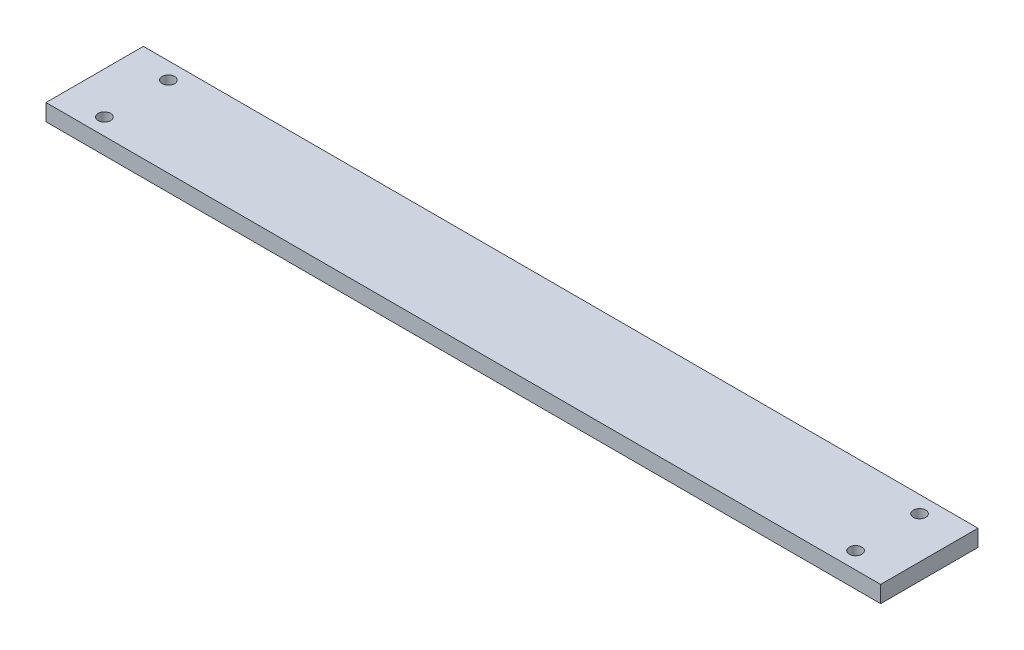
ISO-10303-21;
HEADER;
FILE_DESCRIPTION(('STEP AP214'),'2;1');
FILE_NAME('part.step','',(''),(''),'','','');
FILE_SCHEMA(('AUTOMOTIVE_DESIGN { 1 0 10303 214 1 1 1 1 }'));
ENDSEC;
DATA;
#1=APPLICATION_CONTEXT('core data for automotive mechanical design processes');
#2=APPLICATION_PROTOCOL_DEFINITION('international standard','automotive_design',2000,#1);
#3=PRODUCT_CONTEXT('',#1,'mechanical');
#4=PRODUCT('Part','Part','',(#3));
#5=PRODUCT_RELATED_PRODUCT_CATEGORY('part','',(#4));
#6=PRODUCT_DEFINITION_FORMATION('','',#4);
#7=PRODUCT_DEFINITION_CONTEXT('part definition',#1,'design');
#8=PRODUCT_DEFINITION('design','',#6,#7);
#9=PRODUCT_DEFINITION_SHAPE('','',#8);
#10=(LENGTH_UNIT() NAMED_UNIT(*) SI_UNIT(.MILLI.,.METRE.));
#11=(NAMED_UNIT(*) PLANE_ANGLE_UNIT() SI_UNIT($,.RADIAN.));
#12=(NAMED_UNIT(*) SI_UNIT($,.STERADIAN.) SOLID_ANGLE_UNIT());
#13=UNCERTAINTY_MEASURE_WITH_UNIT(LENGTH_MEASURE(1.E-05),#10,'distance_accuracy_value','');
#14=(GEOMETRIC_REPRESENTATION_CONTEXT(3) GLOBAL_UNCERTAINTY_ASSIGNED_CONTEXT((#13)) GLOBAL_UNIT_ASSIGNED_CONTEXT((#10,
#11,#12)) REPRESENTATION_CONTEXT('',''));
#15=CARTESIAN_POINT('',(0.,0.,0.));
#16=DIRECTION('',(0.,0.,1.));
#17=DIRECTION('',(1.,0.,0.));
#18=AXIS2_PLACEMENT_3D('',#15,#16,#17);
#19=CARTESIAN_POINT('',(0.,12.,0.));
#20=DIRECTION('',(0.,-1.,0.));
#21=DIRECTION('',(0.,0.,-1.));
#22=AXIS2_PLACEMENT_3D('',#19,#20,#21);
#23=PLANE('',#22);
#24=DIRECTION('',(0.,0.,-1.));
#25=VECTOR('',#24,1.);
#26=CARTESIAN_POINT('',(300.,12.,35.));
#27=LINE('',#26,#25);
#28=CARTESIAN_POINT('',(300.,12.,35.));
#29=VERTEX_POINT('',#28);
#30=CARTESIAN_POINT('',(300.,12.,-35.));
#31=VERTEX_POINT('',#30);
#32=EDGE_CURVE('E89',#29,#31,#27,.T.);
#33=ORIENTED_EDGE('',*,*,#32,.T.);
#34=DIRECTION('',(-1.,0.,0.));
#35=VECTOR('',#34,1.);
#36=CARTESIAN_POINT('',(-300.,12.,-35.));
#37=LINE('',#36,#35);
#38=CARTESIAN_POINT('',(-300.,12.,-35.));
#39=VERTEX_POINT('',#38);
#40=EDGE_CURVE('E84',#31,#39,#37,.T.);
#41=ORIENTED_EDGE('',*,*,#40,.T.);
#42=DIRECTION('',(0.,0.,1.));
#43=VECTOR('',#42,1.);
#44=CARTESIAN_POINT('',(-300.,12.,35.));
#45=LINE('',#44,#43);
#46=CARTESIAN_POINT('',(-300.,12.,35.));
#47=VERTEX_POINT('',#46);
#48=EDGE_CURVE('E87',#39,#47,#45,.T.);
#49=ORIENTED_EDGE('',*,*,#48,.T.);
#50=DIRECTION('',(1.,0.,0.));
#51=VECTOR('',#50,1.);
#52=CARTESIAN_POINT('',(-300.,12.,35.));
#53=LINE('',#52,#51);
#54=EDGE_CURVE('E54',#47,#29,#53,.T.);
#55=ORIENTED_EDGE('',*,*,#54,.T.);
#56=EDGE_LOOP('',(#33,#41,#49,#55));
#57=FACE_BOUND('',#56,.T.);
#58=CARTESIAN_POINT('',(-270.,12.,23.));
#59=DIRECTION('',(0.,1.,0.));
#60=DIRECTION('',(0.,0.,1.));
#61=AXIS2_PLACEMENT_3D('',#58,#59,#60);
#62=CIRCLE('',#61,4.50000000000002);
#63=CARTESIAN_POINT('',(-270.,12.,27.5));
#64=VERTEX_POINT('',#63);
#65=EDGE_CURVE('E104',#64,#64,#62,.T.);
#66=ORIENTED_EDGE('',*,*,#65,.F.);
#67=EDGE_LOOP('',(#66));
#68=FACE_BOUND('',#67,.T.);
#69=CARTESIAN_POINT('',(-270.,12.,-23.));
#70=DIRECTION('',(0.,1.,0.));
#71=DIRECTION('',(0.,0.,1.));
#72=AXIS2_PLACEMENT_3D('',#69,#70,#71);
#73=CIRCLE('',#72,4.50000000000002);
#74=CARTESIAN_POINT('',(-270.,12.,-18.5));
#75=VERTEX_POINT('',#74);
#76=EDGE_CURVE('E119',#75,#75,#73,.T.);
#77=ORIENTED_EDGE('',*,*,#76,.F.);
#78=EDGE_LOOP('',(#77));
#79=FACE_BOUND('',#78,.T.);
#80=CARTESIAN_POINT('',(270.,12.,23.));
#81=DIRECTION('',(0.,1.,0.));
#82=DIRECTION('',(0.,0.,1.));
#83=AXIS2_PLACEMENT_3D('',#80,#81,#82);
#84=CIRCLE('',#83,4.50000000000002);
#85=CARTESIAN_POINT('',(270.,12.,27.5));
#86=VERTEX_POINT('',#85);
#87=EDGE_CURVE('E125',#86,#86,#84,.T.);
#88=ORIENTED_EDGE('',*,*,#87,.F.);
#89=EDGE_LOOP('',(#88));
#90=FACE_BOUND('',#89,.T.);
#91=CARTESIAN_POINT('',(270.,12.,-23.));
#92=DIRECTION('',(0.,1.,0.));
#93=DIRECTION('',(0.,0.,1.));
#94=AXIS2_PLACEMENT_3D('',#91,#92,#93);
#95=CIRCLE('',#94,4.50000000000002);
#96=CARTESIAN_POINT('',(270.,12.,-18.5));
#97=VERTEX_POINT('',#96);
#98=EDGE_CURVE('E131',#97,#97,#95,.T.);
#99=ORIENTED_EDGE('',*,*,#98,.F.);
#100=EDGE_LOOP('',(#99));
#101=FACE_BOUND('',#100,.T.);
#102=ADVANCED_FACE('F37',(#57,#68,#79,#90,#101),#23,.F.);
#103=CARTESIAN_POINT('',(0.,0.,0.));
#104=DIRECTION('',(0.,-1.,0.));
#105=DIRECTION('',(0.,0.,-1.));
#106=AXIS2_PLACEMENT_3D('',#103,#104,#105);
#107=PLANE('',#106);
#108=CARTESIAN_POINT('',(270.,0.,23.));
#109=DIRECTION('',(0.,1.,0.));
#110=DIRECTION('',(0.,0.,1.));
#111=AXIS2_PLACEMENT_3D('',#108,#109,#110);
#112=CIRCLE('',#111,4.50000000000002);
#113=CARTESIAN_POINT('',(270.,0.,27.5));
#114=VERTEX_POINT('',#113);
#115=EDGE_CURVE('E128',#114,#114,#112,.T.);
#116=ORIENTED_EDGE('',*,*,#115,.T.);
#117=EDGE_LOOP('',(#116));
#118=FACE_BOUND('',#117,.T.);
#119=CARTESIAN_POINT('',(-270.,0.,23.));
#120=DIRECTION('',(0.,1.,0.));
#121=DIRECTION('',(0.,0.,1.));
#122=AXIS2_PLACEMENT_3D('',#119,#120,#121);
#123=CIRCLE('',#122,4.50000000000002);
#124=CARTESIAN_POINT('',(-270.,0.,27.5));
#125=VERTEX_POINT('',#124);
#126=EDGE_CURVE('E116',#125,#125,#123,.T.);
#127=ORIENTED_EDGE('',*,*,#126,.T.);
#128=EDGE_LOOP('',(#127));
#129=FACE_BOUND('',#128,.T.);
#130=DIRECTION('',(0.,0.,-1.));
#131=VECTOR('',#130,1.);
#132=CARTESIAN_POINT('',(300.,0.,35.));
#133=LINE('',#132,#131);
#134=CARTESIAN_POINT('',(300.,0.,35.));
#135=VERTEX_POINT('',#134);
#136=CARTESIAN_POINT('',(300.,0.,-35.));
#137=VERTEX_POINT('',#136);
#138=EDGE_CURVE('E101',#135,#137,#133,.T.);
#139=ORIENTED_EDGE('',*,*,#138,.F.);
#140=DIRECTION('',(1.,0.,0.));
#141=VECTOR('',#140,1.);
#142=CARTESIAN_POINT('',(-300.,0.,35.));
#143=LINE('',#142,#141);
#144=CARTESIAN_POINT('',(-300.,0.,35.));
#145=VERTEX_POINT('',#144);
#146=EDGE_CURVE('E77',#145,#135,#143,.T.);
#147=ORIENTED_EDGE('',*,*,#146,.F.);
#148=DIRECTION('',(0.,0.,1.));
#149=VECTOR('',#148,1.);
#150=CARTESIAN_POINT('',(-300.,0.,35.));
#151=LINE('',#150,#149);
#152=CARTESIAN_POINT('',(-300.,0.,-35.));
#153=VERTEX_POINT('',#152);
#154=EDGE_CURVE('E71',#153,#145,#151,.T.);
#155=ORIENTED_EDGE('',*,*,#154,.F.);
#156=DIRECTION('',(-1.,0.,0.));
#157=VECTOR('',#156,1.);
#158=CARTESIAN_POINT('',(-300.,0.,-35.));
#159=LINE('',#158,#157);
#160=EDGE_CURVE('E93',#137,#153,#159,.T.);
#161=ORIENTED_EDGE('',*,*,#160,.F.);
#162=EDGE_LOOP('',(#139,#147,#155,#161));
#163=FACE_BOUND('',#162,.T.);
#164=CARTESIAN_POINT('',(-270.,0.,-23.));
#165=DIRECTION('',(0.,1.,0.));
#166=DIRECTION('',(0.,0.,1.));
#167=AXIS2_PLACEMENT_3D('',#164,#165,#166);
#168=CIRCLE('',#167,4.50000000000002);
#169=CARTESIAN_POINT('',(-270.,0.,-18.5));
#170=VERTEX_POINT('',#169);
#171=EDGE_CURVE('E122',#170,#170,#168,.T.);
#172=ORIENTED_EDGE('',*,*,#171,.T.);
#173=EDGE_LOOP('',(#172));
#174=FACE_BOUND('',#173,.T.);
#175=CARTESIAN_POINT('',(270.,0.,-23.));
#176=DIRECTION('',(0.,1.,0.));
#177=DIRECTION('',(0.,0.,1.));
#178=AXIS2_PLACEMENT_3D('',#175,#176,#177);
#179=CIRCLE('',#178,4.50000000000002);
#180=CARTESIAN_POINT('',(270.,0.,-18.5));
#181=VERTEX_POINT('',#180);
#182=EDGE_CURVE('E134',#181,#181,#179,.T.);
#183=ORIENTED_EDGE('',*,*,#182,.T.);
#184=EDGE_LOOP('',(#183));
#185=FACE_BOUND('',#184,.T.);
#186=ADVANCED_FACE('F112',(#118,#129,#163,#174,#185),#107,.T.);
#187=CARTESIAN_POINT('',(300.,12.,35.));
#188=DIRECTION('',(-1.,0.,0.));
#189=DIRECTION('',(0.,0.,1.));
#190=AXIS2_PLACEMENT_3D('',#187,#188,#189);
#191=PLANE('',#190);
#192=ORIENTED_EDGE('',*,*,#138,.T.);
#193=DIRECTION('',(0.,-1.,0.));
#194=VECTOR('',#193,1.);
#195=CARTESIAN_POINT('',(300.,12.,-35.));
#196=LINE('',#195,#194);
#197=EDGE_CURVE('E11',#31,#137,#196,.T.);
#198=ORIENTED_EDGE('',*,*,#197,.F.);
#199=ORIENTED_EDGE('',*,*,#32,.F.);
#200=DIRECTION('',(0.,-1.,0.));
#201=VECTOR('',#200,1.);
#202=CARTESIAN_POINT('',(300.,12.,35.));
#203=LINE('',#202,#201);
#204=EDGE_CURVE('E97',#29,#135,#203,.T.);
#205=ORIENTED_EDGE('',*,*,#204,.T.);
#206=EDGE_LOOP('',(#192,#198,#199,#205));
#207=FACE_BOUND('',#206,.T.);
#208=ADVANCED_FACE('F39',(#207),#191,.F.);
#209=CARTESIAN_POINT('',(-300.,12.,-35.));
#210=DIRECTION('',(0.,0.,1.));
#211=DIRECTION('',(1.,0.,0.));
#212=AXIS2_PLACEMENT_3D('',#209,#210,#211);
#213=PLANE('',#212);
#214=ORIENTED_EDGE('',*,*,#160,.T.);
#215=DIRECTION('',(0.,-1.,0.));
#216=VECTOR('',#215,1.);
#217=CARTESIAN_POINT('',(-300.,12.,-35.));
#218=LINE('',#217,#216);
#219=EDGE_CURVE('E46',#39,#153,#218,.T.);
#220=ORIENTED_EDGE('',*,*,#219,.F.);
#221=ORIENTED_EDGE('',*,*,#40,.F.);
#222=ORIENTED_EDGE('',*,*,#197,.T.);
#223=EDGE_LOOP('',(#214,#220,#221,#222));
#224=FACE_BOUND('',#223,.T.);
#225=ADVANCED_FACE('F92',(#224),#213,.F.);
#226=CARTESIAN_POINT('',(-300.,12.,35.));
#227=DIRECTION('',(1.,0.,0.));
#228=DIRECTION('',(0.,0.,-1.));
#229=AXIS2_PLACEMENT_3D('',#226,#227,#228);
#230=PLANE('',#229);
#231=ORIENTED_EDGE('',*,*,#154,.T.);
#232=DIRECTION('',(0.,-1.,0.));
#233=VECTOR('',#232,1.);
#234=CARTESIAN_POINT('',(-300.,12.,35.));
#235=LINE('',#234,#233);
#236=EDGE_CURVE('E94',#47,#145,#235,.T.);
#237=ORIENTED_EDGE('',*,*,#236,.F.);
#238=ORIENTED_EDGE('',*,*,#48,.F.);
#239=ORIENTED_EDGE('',*,*,#219,.T.);
#240=EDGE_LOOP('',(#231,#237,#238,#239));
#241=FACE_BOUND('',#240,.T.);
#242=ADVANCED_FACE('F95',(#241),#230,.F.);
#243=CARTESIAN_POINT('',(-300.,12.,35.));
#244=DIRECTION('',(0.,0.,-1.));
#245=DIRECTION('',(-1.,0.,0.));
#246=AXIS2_PLACEMENT_3D('',#243,#244,#245);
#247=PLANE('',#246);
#248=ORIENTED_EDGE('',*,*,#146,.T.);
#249=ORIENTED_EDGE('',*,*,#204,.F.);
#250=ORIENTED_EDGE('',*,*,#54,.F.);
#251=ORIENTED_EDGE('',*,*,#236,.T.);
#252=EDGE_LOOP('',(#248,#249,#250,#251));
#253=FACE_BOUND('',#252,.T.);
#254=ADVANCED_FACE('F109',(#253),#247,.F.);
#255=CARTESIAN_POINT('',(-270.,12.,23.));
#256=DIRECTION('',(0.,-1.,0.));
#257=DIRECTION('',(0.,0.,-1.));
#258=AXIS2_PLACEMENT_3D('',#255,#256,#257);
#259=CYLINDRICAL_SURFACE('',#258,4.50000000000002);
#260=ORIENTED_EDGE('',*,*,#65,.T.);
#261=EDGE_LOOP('',(#260));
#262=FACE_BOUND('',#261,.T.);
#263=ORIENTED_EDGE('',*,*,#126,.F.);
#264=EDGE_LOOP('',(#263));
#265=FACE_BOUND('',#264,.T.);
#266=ADVANCED_FACE('F151',(#262,#265),#259,.F.);
#267=CARTESIAN_POINT('',(-270.,12.,-23.));
#268=DIRECTION('',(0.,-1.,0.));
#269=DIRECTION('',(0.,0.,-1.));
#270=AXIS2_PLACEMENT_3D('',#267,#268,#269);
#271=CYLINDRICAL_SURFACE('',#270,4.50000000000002);
#272=ORIENTED_EDGE('',*,*,#76,.T.);
#273=EDGE_LOOP('',(#272));
#274=FACE_BOUND('',#273,.T.);
#275=ORIENTED_EDGE('',*,*,#171,.F.);
#276=EDGE_LOOP('',(#275));
#277=FACE_BOUND('',#276,.T.);
#278=ADVANCED_FACE('F205',(#274,#277),#271,.F.);
#279=CARTESIAN_POINT('',(270.,12.,23.));
#280=DIRECTION('',(0.,-1.,0.));
#281=DIRECTION('',(0.,0.,-1.));
#282=AXIS2_PLACEMENT_3D('',#279,#280,#281);
#283=CYLINDRICAL_SURFACE('',#282,4.50000000000002);
#284=ORIENTED_EDGE('',*,*,#87,.T.);
#285=EDGE_LOOP('',(#284));
#286=FACE_BOUND('',#285,.T.);
#287=ORIENTED_EDGE('',*,*,#115,.F.);
#288=EDGE_LOOP('',(#287));
#289=FACE_BOUND('',#288,.T.);
#290=ADVANCED_FACE('F214',(#286,#289),#283,.F.);
#291=CARTESIAN_POINT('',(270.,12.,-23.));
#292=DIRECTION('',(0.,-1.,0.));
#293=DIRECTION('',(0.,0.,-1.));
#294=AXIS2_PLACEMENT_3D('',#291,#292,#293);
#295=CYLINDRICAL_SURFACE('',#294,4.50000000000002);
#296=ORIENTED_EDGE('',*,*,#98,.T.);
#297=EDGE_LOOP('',(#296));
#298=FACE_BOUND('',#297,.T.);
#299=ORIENTED_EDGE('',*,*,#182,.F.);
#300=EDGE_LOOP('',(#299));
#301=FACE_BOUND('',#300,.T.);
#302=ADVANCED_FACE('F140',(#298,#301),#295,.F.);
#303=CLOSED_SHELL('',(#102,#186,#208,#225,#242,#254,#266,#278,#290,#302));
#304=MANIFOLD_SOLID_BREP('B2',#303);
#305=ADVANCED_BREP_SHAPE_REPRESENTATION('',(#18,#304),#14);
#306=SHAPE_DEFINITION_REPRESENTATION(#9,#305);
ENDSEC;
END-ISO-10303-21;
